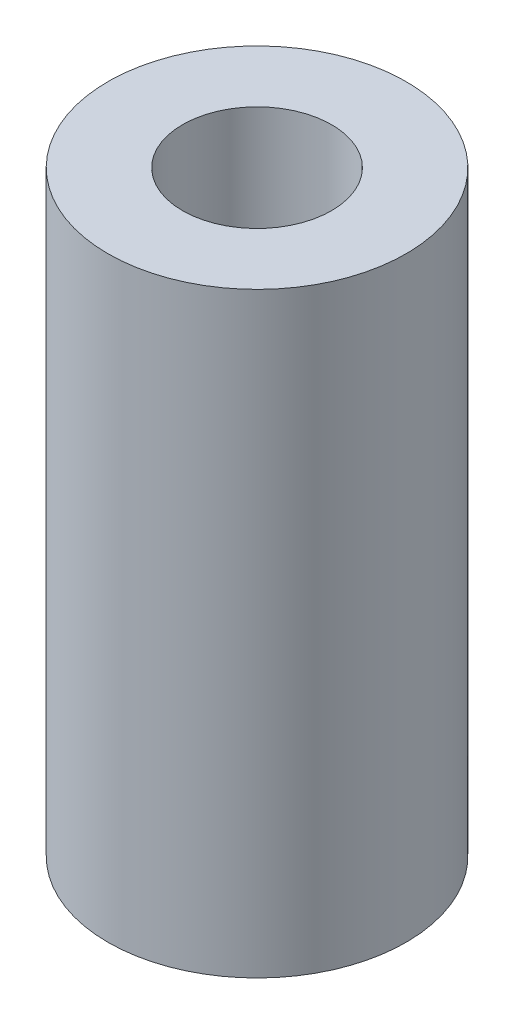
ISO-10303-21;
HEADER;
FILE_DESCRIPTION(('STEP AP214'),'2;1');
FILE_NAME('part.step','',(''),(''),'','','');
FILE_SCHEMA(('AUTOMOTIVE_DESIGN { 1 0 10303 214 1 1 1 1 }'));
ENDSEC;
DATA;
#1=APPLICATION_CONTEXT('core data for automotive mechanical design processes');
#2=APPLICATION_PROTOCOL_DEFINITION('international standard','automotive_design',2000,#1);
#3=PRODUCT_CONTEXT('',#1,'mechanical');
#4=PRODUCT('Part','Part','',(#3));
#5=PRODUCT_RELATED_PRODUCT_CATEGORY('part','',(#4));
#6=PRODUCT_DEFINITION_FORMATION('','',#4);
#7=PRODUCT_DEFINITION_CONTEXT('part definition',#1,'design');
#8=PRODUCT_DEFINITION('design','',#6,#7);
#9=PRODUCT_DEFINITION_SHAPE('','',#8);
#10=(LENGTH_UNIT() NAMED_UNIT(*) SI_UNIT(.MILLI.,.METRE.));
#11=(NAMED_UNIT(*) PLANE_ANGLE_UNIT() SI_UNIT($,.RADIAN.));
#12=(NAMED_UNIT(*) SI_UNIT($,.STERADIAN.) SOLID_ANGLE_UNIT());
#13=UNCERTAINTY_MEASURE_WITH_UNIT(LENGTH_MEASURE(1.E-05),#10,'distance_accuracy_value','');
#14=(GEOMETRIC_REPRESENTATION_CONTEXT(3) GLOBAL_UNCERTAINTY_ASSIGNED_CONTEXT((#13)) GLOBAL_UNIT_ASSIGNED_CONTEXT((#10,
#11,#12)) REPRESENTATION_CONTEXT('',''));
#15=CARTESIAN_POINT('',(0.,0.,0.));
#16=DIRECTION('',(0.,0.,1.));
#17=DIRECTION('',(1.,0.,0.));
#18=AXIS2_PLACEMENT_3D('',#15,#16,#17);
#19=CARTESIAN_POINT('',(0.,8.,0.));
#20=DIRECTION('',(0.,1.,0.));
#21=DIRECTION('',(0.,0.,1.));
#22=AXIS2_PLACEMENT_3D('',#19,#20,#21);
#23=PLANE('',#22);
#24=CARTESIAN_POINT('',(0.,8.,0.));
#25=DIRECTION('',(0.,1.,0.));
#26=DIRECTION('',(0.,0.,1.));
#27=AXIS2_PLACEMENT_3D('',#24,#25,#26);
#28=CIRCLE('',#27,4.);
#29=CARTESIAN_POINT('',(0.,8.,4.));
#30=VERTEX_POINT('',#29);
#31=EDGE_CURVE('E10',#30,#30,#28,.T.);
#32=ORIENTED_EDGE('',*,*,#31,.T.);
#33=EDGE_LOOP('',(#32));
#34=FACE_BOUND('',#33,.T.);
#35=CARTESIAN_POINT('',(0.,8.,0.));
#36=DIRECTION('',(0.,1.,0.));
#37=DIRECTION('',(0.,0.,1.));
#38=AXIS2_PLACEMENT_3D('',#35,#36,#37);
#39=CIRCLE('',#38,2.);
#40=CARTESIAN_POINT('',(0.,8.,2.));
#41=VERTEX_POINT('',#40);
#42=EDGE_CURVE('E44',#41,#41,#39,.T.);
#43=ORIENTED_EDGE('',*,*,#42,.F.);
#44=EDGE_LOOP('',(#43));
#45=FACE_BOUND('',#44,.T.);
#46=ADVANCED_FACE('F33',(#34,#45),#23,.T.);
#47=CARTESIAN_POINT('',(0.,-8.,0.));
#48=DIRECTION('',(0.,1.,0.));
#49=DIRECTION('',(0.,0.,1.));
#50=AXIS2_PLACEMENT_3D('',#47,#48,#49);
#51=PLANE('',#50);
#52=CARTESIAN_POINT('',(0.,-8.,0.));
#53=DIRECTION('',(0.,1.,0.));
#54=DIRECTION('',(0.,0.,1.));
#55=AXIS2_PLACEMENT_3D('',#52,#53,#54);
#56=CIRCLE('',#55,4.);
#57=CARTESIAN_POINT('',(0.,-8.,4.));
#58=VERTEX_POINT('',#57);
#59=EDGE_CURVE('E37',#58,#58,#56,.T.);
#60=ORIENTED_EDGE('',*,*,#59,.F.);
#61=EDGE_LOOP('',(#60));
#62=FACE_BOUND('',#61,.T.);
#63=CARTESIAN_POINT('',(0.,-8.,0.));
#64=DIRECTION('',(0.,1.,0.));
#65=DIRECTION('',(0.,0.,1.));
#66=AXIS2_PLACEMENT_3D('',#63,#64,#65);
#67=CIRCLE('',#66,2.);
#68=CARTESIAN_POINT('',(0.,-8.,2.));
#69=VERTEX_POINT('',#68);
#70=EDGE_CURVE('E46',#69,#69,#67,.T.);
#71=ORIENTED_EDGE('',*,*,#70,.T.);
#72=EDGE_LOOP('',(#71));
#73=FACE_BOUND('',#72,.T.);
#74=ADVANCED_FACE('F56',(#62,#73),#51,.F.);
#75=CARTESIAN_POINT('',(0.,8.,0.));
#76=DIRECTION('',(0.,-1.,0.));
#77=DIRECTION('',(0.,0.,-1.));
#78=AXIS2_PLACEMENT_3D('',#75,#76,#77);
#79=CYLINDRICAL_SURFACE('',#78,4.);
#80=ORIENTED_EDGE('',*,*,#31,.F.);
#81=EDGE_LOOP('',(#80));
#82=FACE_BOUND('',#81,.T.);
#83=ORIENTED_EDGE('',*,*,#59,.T.);
#84=EDGE_LOOP('',(#83));
#85=FACE_BOUND('',#84,.T.);
#86=ADVANCED_FACE('F35',(#82,#85),#79,.T.);
#87=CARTESIAN_POINT('',(0.,8.,0.));
#88=DIRECTION('',(0.,-1.,0.));
#89=DIRECTION('',(0.,0.,-1.));
#90=AXIS2_PLACEMENT_3D('',#87,#88,#89);
#91=CYLINDRICAL_SURFACE('',#90,2.);
#92=ORIENTED_EDGE('',*,*,#42,.T.);
#93=EDGE_LOOP('',(#92));
#94=FACE_BOUND('',#93,.T.);
#95=ORIENTED_EDGE('',*,*,#70,.F.);
#96=EDGE_LOOP('',(#95));
#97=FACE_BOUND('',#96,.T.);
#98=ADVANCED_FACE('F52',(#94,#97),#91,.F.);
#99=CLOSED_SHELL('',(#46,#74,#86,#98));
#100=MANIFOLD_SOLID_BREP('B2',#99);
#101=ADVANCED_BREP_SHAPE_REPRESENTATION('',(#18,#100),#14);
#102=SHAPE_DEFINITION_REPRESENTATION(#9,#101);
ENDSEC;
END-ISO-10303-21;
